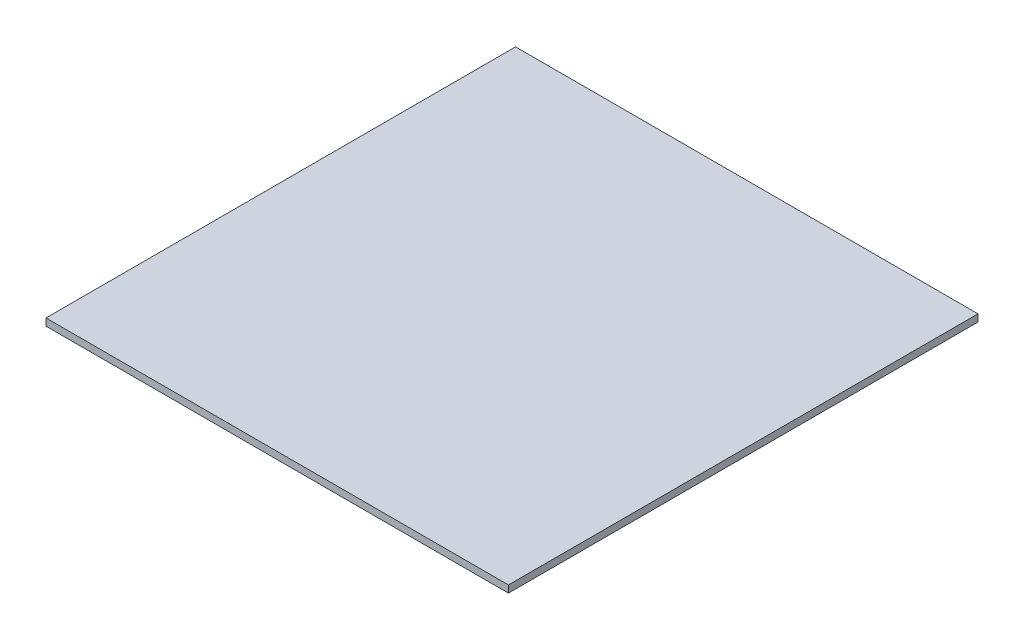
ISO-10303-21;
HEADER;
FILE_DESCRIPTION(('STEP AP214'),'2;1');
FILE_NAME('part.step','',(''),(''),'','','');
FILE_SCHEMA(('AUTOMOTIVE_DESIGN { 1 0 10303 214 1 1 1 1 }'));
ENDSEC;
DATA;
#1=APPLICATION_CONTEXT('core data for automotive mechanical design processes');
#2=APPLICATION_PROTOCOL_DEFINITION('international standard','automotive_design',2000,#1);
#3=PRODUCT_CONTEXT('',#1,'mechanical');
#4=PRODUCT('Part','Part','',(#3));
#5=PRODUCT_RELATED_PRODUCT_CATEGORY('part','',(#4));
#6=PRODUCT_DEFINITION_FORMATION('','',#4);
#7=PRODUCT_DEFINITION_CONTEXT('part definition',#1,'design');
#8=PRODUCT_DEFINITION('design','',#6,#7);
#9=PRODUCT_DEFINITION_SHAPE('','',#8);
#10=(LENGTH_UNIT() NAMED_UNIT(*) SI_UNIT(.MILLI.,.METRE.));
#11=(NAMED_UNIT(*) PLANE_ANGLE_UNIT() SI_UNIT($,.RADIAN.));
#12=(NAMED_UNIT(*) SI_UNIT($,.STERADIAN.) SOLID_ANGLE_UNIT());
#13=UNCERTAINTY_MEASURE_WITH_UNIT(LENGTH_MEASURE(1.E-05),#10,'distance_accuracy_value','');
#14=(GEOMETRIC_REPRESENTATION_CONTEXT(3) GLOBAL_UNCERTAINTY_ASSIGNED_CONTEXT((#13)) GLOBAL_UNIT_ASSIGNED_CONTEXT((#10,
#11,#12)) REPRESENTATION_CONTEXT('',''));
#15=CARTESIAN_POINT('',(0.,0.,0.));
#16=DIRECTION('',(0.,0.,1.));
#17=DIRECTION('',(1.,0.,0.));
#18=AXIS2_PLACEMENT_3D('',#15,#16,#17);
#19=CARTESIAN_POINT('',(103.1875,3.175,104.775));
#20=DIRECTION('',(-1.,0.,0.));
#21=DIRECTION('',(0.,0.,1.));
#22=AXIS2_PLACEMENT_3D('',#19,#20,#21);
#23=PLANE('',#22);
#24=DIRECTION('',(0.,0.,-1.));
#25=VECTOR('',#24,1.);
#26=CARTESIAN_POINT('',(103.1875,0.,104.775));
#27=LINE('',#26,#25);
#28=CARTESIAN_POINT('',(103.1875,0.,104.775));
#29=VERTEX_POINT('',#28);
#30=CARTESIAN_POINT('',(103.1875,0.,-104.775));
#31=VERTEX_POINT('',#30);
#32=EDGE_CURVE('E99',#29,#31,#27,.T.);
#33=ORIENTED_EDGE('',*,*,#32,.T.);
#34=DIRECTION('',(0.,-1.,0.));
#35=VECTOR('',#34,1.);
#36=CARTESIAN_POINT('',(103.1875,3.175,-104.775));
#37=LINE('',#36,#35);
#38=CARTESIAN_POINT('',(103.1875,3.175,-104.775));
#39=VERTEX_POINT('',#38);
#40=EDGE_CURVE('E11',#39,#31,#37,.T.);
#41=ORIENTED_EDGE('',*,*,#40,.F.);
#42=DIRECTION('',(0.,0.,-1.));
#43=VECTOR('',#42,1.);
#44=CARTESIAN_POINT('',(103.1875,3.175,104.775));
#45=LINE('',#44,#43);
#46=CARTESIAN_POINT('',(103.1875,3.175,104.775));
#47=VERTEX_POINT('',#46);
#48=EDGE_CURVE('E87',#47,#39,#45,.T.);
#49=ORIENTED_EDGE('',*,*,#48,.F.);
#50=DIRECTION('',(0.,-1.,0.));
#51=VECTOR('',#50,1.);
#52=CARTESIAN_POINT('',(103.1875,3.175,104.775));
#53=LINE('',#52,#51);
#54=EDGE_CURVE('E95',#47,#29,#53,.T.);
#55=ORIENTED_EDGE('',*,*,#54,.T.);
#56=EDGE_LOOP('',(#33,#41,#49,#55));
#57=FACE_BOUND('',#56,.T.);
#58=ADVANCED_FACE('F36',(#57),#23,.F.);
#59=CARTESIAN_POINT('',(-103.1875,3.175,-104.775));
#60=DIRECTION('',(0.,0.,1.));
#61=DIRECTION('',(1.,0.,0.));
#62=AXIS2_PLACEMENT_3D('',#59,#60,#61);
#63=PLANE('',#62);
#64=DIRECTION('',(-1.,0.,0.));
#65=VECTOR('',#64,1.);
#66=CARTESIAN_POINT('',(-103.1875,0.,-104.775));
#67=LINE('',#66,#65);
#68=CARTESIAN_POINT('',(-103.1875,0.,-104.775));
#69=VERTEX_POINT('',#68);
#70=EDGE_CURVE('E91',#31,#69,#67,.T.);
#71=ORIENTED_EDGE('',*,*,#70,.T.);
#72=DIRECTION('',(0.,-1.,0.));
#73=VECTOR('',#72,1.);
#74=CARTESIAN_POINT('',(-103.1875,3.175,-104.775));
#75=LINE('',#74,#73);
#76=CARTESIAN_POINT('',(-103.1875,3.175,-104.775));
#77=VERTEX_POINT('',#76);
#78=EDGE_CURVE('E44',#77,#69,#75,.T.);
#79=ORIENTED_EDGE('',*,*,#78,.F.);
#80=DIRECTION('',(-1.,0.,0.));
#81=VECTOR('',#80,1.);
#82=CARTESIAN_POINT('',(-103.1875,3.175,-104.775));
#83=LINE('',#82,#81);
#84=EDGE_CURVE('E82',#39,#77,#83,.T.);
#85=ORIENTED_EDGE('',*,*,#84,.F.);
#86=ORIENTED_EDGE('',*,*,#40,.T.);
#87=EDGE_LOOP('',(#71,#79,#85,#86));
#88=FACE_BOUND('',#87,.T.);
#89=ADVANCED_FACE('F90',(#88),#63,.F.);
#90=CARTESIAN_POINT('',(-103.1875,3.175,104.775));
#91=DIRECTION('',(1.,0.,0.));
#92=DIRECTION('',(0.,0.,-1.));
#93=AXIS2_PLACEMENT_3D('',#90,#91,#92);
#94=PLANE('',#93);
#95=DIRECTION('',(0.,0.,1.));
#96=VECTOR('',#95,1.);
#97=CARTESIAN_POINT('',(-103.1875,0.,104.775));
#98=LINE('',#97,#96);
#99=CARTESIAN_POINT('',(-103.1875,0.,104.775));
#100=VERTEX_POINT('',#99);
#101=EDGE_CURVE('E69',#69,#100,#98,.T.);
#102=ORIENTED_EDGE('',*,*,#101,.T.);
#103=DIRECTION('',(0.,-1.,0.));
#104=VECTOR('',#103,1.);
#105=CARTESIAN_POINT('',(-103.1875,3.175,104.775));
#106=LINE('',#105,#104);
#107=CARTESIAN_POINT('',(-103.1875,3.175,104.775));
#108=VERTEX_POINT('',#107);
#109=EDGE_CURVE('E92',#108,#100,#106,.T.);
#110=ORIENTED_EDGE('',*,*,#109,.F.);
#111=DIRECTION('',(0.,0.,1.));
#112=VECTOR('',#111,1.);
#113=CARTESIAN_POINT('',(-103.1875,3.175,104.775));
#114=LINE('',#113,#112);
#115=EDGE_CURVE('E85',#77,#108,#114,.T.);
#116=ORIENTED_EDGE('',*,*,#115,.F.);
#117=ORIENTED_EDGE('',*,*,#78,.T.);
#118=EDGE_LOOP('',(#102,#110,#116,#117));
#119=FACE_BOUND('',#118,.T.);
#120=ADVANCED_FACE('F93',(#119),#94,.F.);
#121=CARTESIAN_POINT('',(-103.1875,3.175,104.775));
#122=DIRECTION('',(0.,0.,-1.));
#123=DIRECTION('',(-1.,0.,0.));
#124=AXIS2_PLACEMENT_3D('',#121,#122,#123);
#125=PLANE('',#124);
#126=DIRECTION('',(1.,0.,0.));
#127=VECTOR('',#126,1.);
#128=CARTESIAN_POINT('',(-103.1875,0.,104.775));
#129=LINE('',#128,#127);
#130=EDGE_CURVE('E75',#100,#29,#129,.T.);
#131=ORIENTED_EDGE('',*,*,#130,.T.);
#132=ORIENTED_EDGE('',*,*,#54,.F.);
#133=DIRECTION('',(1.,0.,0.));
#134=VECTOR('',#133,1.);
#135=CARTESIAN_POINT('',(-103.1875,3.175,104.775));
#136=LINE('',#135,#134);
#137=EDGE_CURVE('E52',#108,#47,#136,.T.);
#138=ORIENTED_EDGE('',*,*,#137,.F.);
#139=ORIENTED_EDGE('',*,*,#109,.T.);
#140=EDGE_LOOP('',(#131,#132,#138,#139));
#141=FACE_BOUND('',#140,.T.);
#142=ADVANCED_FACE('F106',(#141),#125,.F.);
#143=CARTESIAN_POINT('',(0.,3.175,0.));
#144=DIRECTION('',(0.,-1.,0.));
#145=DIRECTION('',(0.,0.,-1.));
#146=AXIS2_PLACEMENT_3D('',#143,#144,#145);
#147=PLANE('',#146);
#148=ORIENTED_EDGE('',*,*,#48,.T.);
#149=ORIENTED_EDGE('',*,*,#84,.T.);
#150=ORIENTED_EDGE('',*,*,#115,.T.);
#151=ORIENTED_EDGE('',*,*,#137,.T.);
#152=EDGE_LOOP('',(#148,#149,#150,#151));
#153=FACE_BOUND('',#152,.T.);
#154=ADVANCED_FACE('F83',(#153),#147,.F.);
#155=CARTESIAN_POINT('',(0.,0.,0.));
#156=DIRECTION('',(0.,-1.,0.));
#157=DIRECTION('',(0.,0.,-1.));
#158=AXIS2_PLACEMENT_3D('',#155,#156,#157);
#159=PLANE('',#158);
#160=ORIENTED_EDGE('',*,*,#32,.F.);
#161=ORIENTED_EDGE('',*,*,#130,.F.);
#162=ORIENTED_EDGE('',*,*,#101,.F.);
#163=ORIENTED_EDGE('',*,*,#70,.F.);
#164=EDGE_LOOP('',(#160,#161,#162,#163));
#165=FACE_BOUND('',#164,.T.);
#166=ADVANCED_FACE('F109',(#165),#159,.T.);
#167=CLOSED_SHELL('',(#58,#89,#120,#142,#154,#166));
#168=MANIFOLD_SOLID_BREP('B2',#167);
#169=ADVANCED_BREP_SHAPE_REPRESENTATION('',(#18,#168),#14);
#170=SHAPE_DEFINITION_REPRESENTATION(#9,#169);
ENDSEC;
END-ISO-10303-21;
